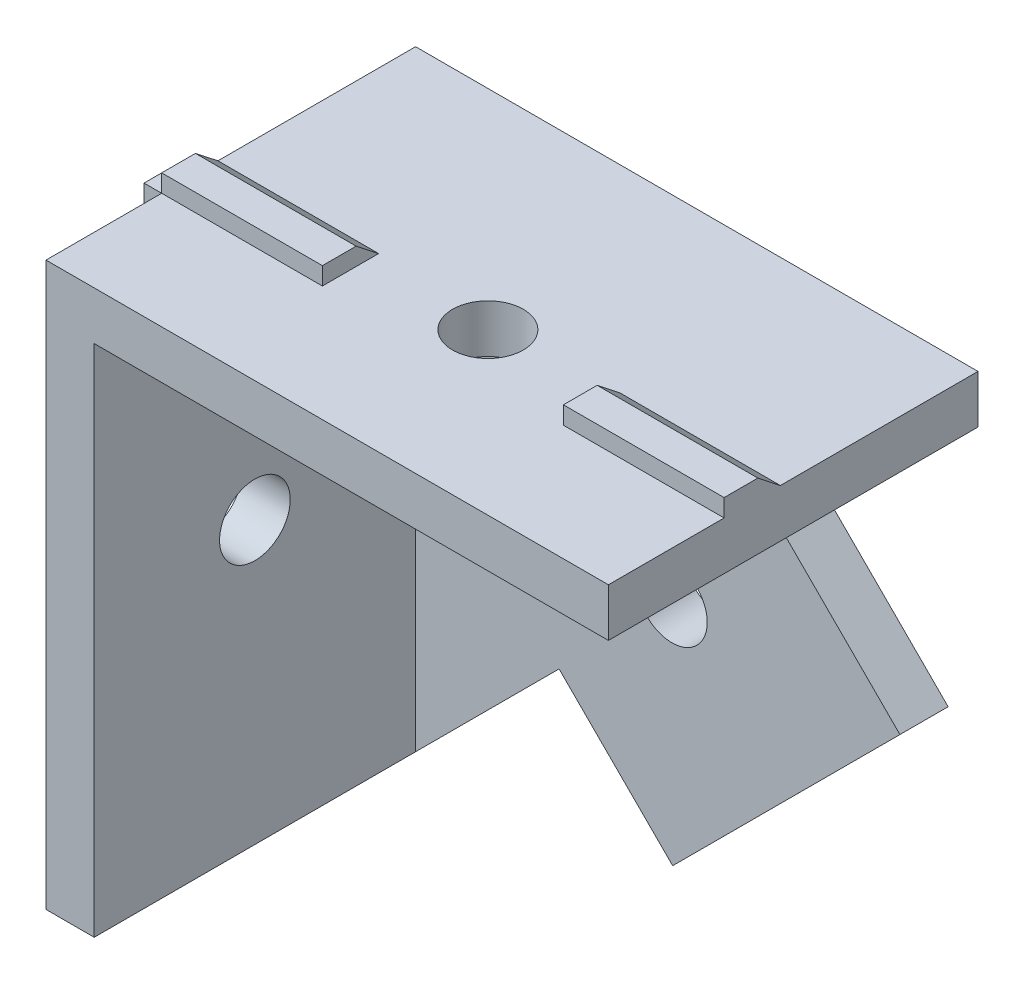
ISO-10303-21;
HEADER;
FILE_DESCRIPTION(('STEP AP214'),'2;1');
FILE_NAME('part.step','',(''),(''),'','','');
FILE_SCHEMA(('AUTOMOTIVE_DESIGN { 1 0 10303 214 1 1 1 1 }'));
ENDSEC;
DATA;
#1=APPLICATION_CONTEXT('core data for automotive mechanical design processes');
#2=APPLICATION_PROTOCOL_DEFINITION('international standard','automotive_design',2000,#1);
#3=PRODUCT_CONTEXT('',#1,'mechanical');
#4=PRODUCT('Part','Part','',(#3));
#5=PRODUCT_RELATED_PRODUCT_CATEGORY('part','',(#4));
#6=PRODUCT_DEFINITION_FORMATION('','',#4);
#7=PRODUCT_DEFINITION_CONTEXT('part definition',#1,'design');
#8=PRODUCT_DEFINITION('design','',#6,#7);
#9=PRODUCT_DEFINITION_SHAPE('','',#8);
#10=(LENGTH_UNIT() NAMED_UNIT(*) SI_UNIT(.MILLI.,.METRE.));
#11=(NAMED_UNIT(*) PLANE_ANGLE_UNIT() SI_UNIT($,.RADIAN.));
#12=(NAMED_UNIT(*) SI_UNIT($,.STERADIAN.) SOLID_ANGLE_UNIT());
#13=UNCERTAINTY_MEASURE_WITH_UNIT(LENGTH_MEASURE(1.E-05),#10,'distance_accuracy_value','');
#14=(GEOMETRIC_REPRESENTATION_CONTEXT(3) GLOBAL_UNCERTAINTY_ASSIGNED_CONTEXT((#13)) GLOBAL_UNIT_ASSIGNED_CONTEXT((#10,
#11,#12)) REPRESENTATION_CONTEXT('',''));
#15=CARTESIAN_POINT('',(0.,0.,0.));
#16=DIRECTION('',(0.,0.,1.));
#17=DIRECTION('',(1.,0.,0.));
#18=AXIS2_PLACEMENT_3D('',#15,#16,#17);
#19=CARTESIAN_POINT('',(35.,-3.,3.));
#20=DIRECTION('',(-0.707106781186547,0.707106781186547,0.));
#21=DIRECTION('',(-0.707106781186548,-0.707106781186548,0.));
#22=AXIS2_PLACEMENT_3D('',#19,#20,#21);
#23=PLANE('',#22);
#24=DIRECTION('',(0.707106781186548,0.707106781186548,0.));
#25=VECTOR('',#24,1.);
#26=CARTESIAN_POINT('',(35.,-3.,3.));
#27=LINE('',#26,#25);
#28=CARTESIAN_POINT('',(26.0705675885735,-11.9294324114265,3.));
#29=VERTEX_POINT('',#28);
#30=CARTESIAN_POINT('',(35.,-3.,3.));
#31=VERTEX_POINT('',#30);
#32=EDGE_CURVE('E50',#29,#31,#27,.T.);
#33=ORIENTED_EDGE('',*,*,#32,.F.);
#34=DIRECTION('',(0.,0.,1.));
#35=VECTOR('',#34,1.);
#36=CARTESIAN_POINT('',(26.0705675885735,-11.9294324114264,-30.0003318948885));
#37=LINE('',#36,#35);
#38=CARTESIAN_POINT('',(26.0705675885735,-11.9294324114264,0.));
#39=VERTEX_POINT('',#38);
#40=EDGE_CURVE('E219',#39,#29,#37,.T.);
#41=ORIENTED_EDGE('',*,*,#40,.F.);
#42=DIRECTION('',(0.707106781186548,0.707106781186548,0.));
#43=VECTOR('',#42,1.);
#44=CARTESIAN_POINT('',(35.,-3.,0.));
#45=LINE('',#44,#43);
#46=CARTESIAN_POINT('',(35.,-3.,0.));
#47=VERTEX_POINT('',#46);
#48=EDGE_CURVE('E217',#39,#47,#45,.T.);
#49=ORIENTED_EDGE('',*,*,#48,.T.);
#50=DIRECTION('',(0.,0.,-1.));
#51=VECTOR('',#50,1.);
#52=CARTESIAN_POINT('',(35.,-3.,3.));
#53=LINE('',#52,#51);
#54=EDGE_CURVE('E378',#31,#47,#53,.T.);
#55=ORIENTED_EDGE('',*,*,#54,.F.);
#56=EDGE_LOOP('',(#33,#41,#49,#55));
#57=FACE_BOUND('',#56,.T.);
#58=ADVANCED_FACE('F34',(#57),#23,.F.);
#59=CARTESIAN_POINT('',(-1.1,3.66878726556882,13.7));
#60=DIRECTION('',(-0.786318338822422,0.,-0.617821551931904));
#61=DIRECTION('',(-0.617821551931904,0.,0.786318338822422));
#62=AXIS2_PLACEMENT_3D('',#59,#60,#61);
#63=PLANE('',#62);
#64=DIRECTION('',(-0.617821551931904,0.,0.786318338822422));
#65=VECTOR('',#64,1.);
#66=CARTESIAN_POINT('',(-1.1,-25.,13.7));
#67=LINE('',#66,#65);
#68=CARTESIAN_POINT('',(0.,-25.,12.3));
#69=VERTEX_POINT('',#68);
#70=CARTESIAN_POINT('',(-1.1,-25.,13.7));
#71=VERTEX_POINT('',#70);
#72=EDGE_CURVE('E261',#69,#71,#67,.T.);
#73=ORIENTED_EDGE('',*,*,#72,.F.);
#74=DIRECTION('',(0.,-1.,0.));
#75=VECTOR('',#74,1.);
#76=CARTESIAN_POINT('',(0.,3.66878726556882,12.3));
#77=LINE('',#76,#75);
#78=CARTESIAN_POINT('',(0.,-35.,12.3));
#79=VERTEX_POINT('',#78);
#80=EDGE_CURVE('E11',#69,#79,#77,.T.);
#81=ORIENTED_EDGE('',*,*,#80,.T.);
#82=DIRECTION('',(0.617821551931904,0.,-0.786318338822422));
#83=VECTOR('',#82,1.);
#84=CARTESIAN_POINT('',(-1.1,-35.,13.7));
#85=LINE('',#84,#83);
#86=CARTESIAN_POINT('',(-1.1,-35.,13.7));
#87=VERTEX_POINT('',#86);
#88=EDGE_CURVE('E263',#87,#79,#85,.T.);
#89=ORIENTED_EDGE('',*,*,#88,.F.);
#90=DIRECTION('',(0.,-1.,0.));
#91=VECTOR('',#90,1.);
#92=CARTESIAN_POINT('',(-1.1,3.66878726556882,13.7));
#93=LINE('',#92,#91);
#94=EDGE_CURVE('E276',#71,#87,#93,.T.);
#95=ORIENTED_EDGE('',*,*,#94,.F.);
#96=EDGE_LOOP('',(#73,#81,#89,#95));
#97=FACE_BOUND('',#96,.T.);
#98=ADVANCED_FACE('F480',(#97),#63,.T.);
#99=CARTESIAN_POINT('',(-1.1,3.66878726556882,15.8));
#100=DIRECTION('',(-1.,0.,0.));
#101=DIRECTION('',(0.,0.,1.));
#102=AXIS2_PLACEMENT_3D('',#99,#100,#101);
#103=PLANE('',#102);
#104=DIRECTION('',(0.,0.,1.));
#105=VECTOR('',#104,1.);
#106=CARTESIAN_POINT('',(-1.1,-25.,-2.50000000007189E-05));
#107=LINE('',#106,#105);
#108=CARTESIAN_POINT('',(-1.1,-25.,15.8));
#109=VERTEX_POINT('',#108);
#110=EDGE_CURVE('E254',#71,#109,#107,.T.);
#111=ORIENTED_EDGE('',*,*,#110,.F.);
#112=ORIENTED_EDGE('',*,*,#94,.T.);
#113=DIRECTION('',(0.,0.,-1.));
#114=VECTOR('',#113,1.);
#115=CARTESIAN_POINT('',(-1.1,-35.,15.8));
#116=LINE('',#115,#114);
#117=CARTESIAN_POINT('',(-1.1,-35.,15.8));
#118=VERTEX_POINT('',#117);
#119=EDGE_CURVE('E268',#118,#87,#116,.T.);
#120=ORIENTED_EDGE('',*,*,#119,.F.);
#121=DIRECTION('',(0.,-1.,0.));
#122=VECTOR('',#121,1.);
#123=CARTESIAN_POINT('',(-1.1,3.66878726556882,15.8));
#124=LINE('',#123,#122);
#125=EDGE_CURVE('E280',#109,#118,#124,.T.);
#126=ORIENTED_EDGE('',*,*,#125,.F.);
#127=EDGE_LOOP('',(#111,#112,#120,#126));
#128=FACE_BOUND('',#127,.T.);
#129=ADVANCED_FACE('F485',(#128),#103,.T.);
#130=CARTESIAN_POINT('',(0.,3.66878726556882,15.8));
#131=DIRECTION('',(0.,0.,1.));
#132=DIRECTION('',(1.,0.,0.));
#133=AXIS2_PLACEMENT_3D('',#130,#131,#132);
#134=PLANE('',#133);
#135=DIRECTION('',(1.,0.,0.));
#136=VECTOR('',#135,1.);
#137=CARTESIAN_POINT('',(0.,-25.,15.8));
#138=LINE('',#137,#136);
#139=CARTESIAN_POINT('',(0.,-25.,15.8));
#140=VERTEX_POINT('',#139);
#141=EDGE_CURVE('E247',#109,#140,#138,.T.);
#142=ORIENTED_EDGE('',*,*,#141,.F.);
#143=ORIENTED_EDGE('',*,*,#125,.T.);
#144=DIRECTION('',(-1.,0.,0.));
#145=VECTOR('',#144,1.);
#146=CARTESIAN_POINT('',(0.,-35.,15.8));
#147=LINE('',#146,#145);
#148=CARTESIAN_POINT('',(0.,-35.,15.8));
#149=VERTEX_POINT('',#148);
#150=EDGE_CURVE('E272',#149,#118,#147,.T.);
#151=ORIENTED_EDGE('',*,*,#150,.F.);
#152=DIRECTION('',(0.,-1.,0.));
#153=VECTOR('',#152,1.);
#154=CARTESIAN_POINT('',(0.,3.66878726556882,15.8));
#155=LINE('',#154,#153);
#156=EDGE_CURVE('E291',#140,#149,#155,.T.);
#157=ORIENTED_EDGE('',*,*,#156,.F.);
#158=EDGE_LOOP('',(#142,#143,#151,#157));
#159=FACE_BOUND('',#158,.T.);
#160=ADVANCED_FACE('F588',(#159),#134,.T.);
#161=CARTESIAN_POINT('',(0.,-35.,3.));
#162=DIRECTION('',(1.,0.,0.));
#163=DIRECTION('',(0.,0.,-1.));
#164=AXIS2_PLACEMENT_3D('',#161,#162,#163);
#165=PLANE('',#164);
#166=DIRECTION('',(0.,0.,-1.));
#167=VECTOR('',#166,1.);
#168=CARTESIAN_POINT('',(0.,0.,12.3));
#169=LINE('',#168,#167);
#170=CARTESIAN_POINT('',(0.,0.,15.8));
#171=VERTEX_POINT('',#170);
#172=CARTESIAN_POINT('',(0.,0.,12.3));
#173=VERTEX_POINT('',#172);
#174=EDGE_CURVE('E312',#171,#173,#169,.T.);
#175=ORIENTED_EDGE('',*,*,#174,.F.);
#176=DIRECTION('',(0.,-1.,0.));
#177=VECTOR('',#176,1.);
#178=CARTESIAN_POINT('',(0.,0.,15.8));
#179=LINE('',#178,#177);
#180=CARTESIAN_POINT('',(0.,1.1,15.8));
#181=VERTEX_POINT('',#180);
#182=EDGE_CURVE('E336',#181,#171,#179,.T.);
#183=ORIENTED_EDGE('',*,*,#182,.F.);
#184=DIRECTION('',(0.,0.,1.));
#185=VECTOR('',#184,1.);
#186=CARTESIAN_POINT('',(0.,1.1,15.8));
#187=LINE('',#186,#185);
#188=CARTESIAN_POINT('',(0.,1.1,13.7));
#189=VERTEX_POINT('',#188);
#190=EDGE_CURVE('E333',#189,#181,#187,.T.);
#191=ORIENTED_EDGE('',*,*,#190,.F.);
#192=DIRECTION('',(0.,0.617821551931904,0.786318338822422));
#193=VECTOR('',#192,1.);
#194=CARTESIAN_POINT('',(0.,1.1,13.7));
#195=LINE('',#194,#193);
#196=EDGE_CURVE('E337',#173,#189,#195,.T.);
#197=ORIENTED_EDGE('',*,*,#196,.F.);
#198=EDGE_LOOP('',(#175,#183,#191,#197));
#199=FACE_BOUND('',#198,.T.);
#200=ADVANCED_FACE('F477',(#199),#165,.F.);
#201=CARTESIAN_POINT('',(0.,0.,15.8));
#202=DIRECTION('',(0.,0.,1.));
#203=DIRECTION('',(1.,0.,0.));
#204=AXIS2_PLACEMENT_3D('',#201,#202,#203);
#205=PLANE('',#204);
#206=DIRECTION('',(0.,1.,0.));
#207=VECTOR('',#206,1.);
#208=CARTESIAN_POINT('',(25.,1.1,15.8));
#209=LINE('',#208,#207);
#210=CARTESIAN_POINT('',(25.,0.,15.8));
#211=VERTEX_POINT('',#210);
#212=CARTESIAN_POINT('',(25.,1.1,15.8));
#213=VERTEX_POINT('',#212);
#214=EDGE_CURVE('E315',#211,#213,#209,.T.);
#215=ORIENTED_EDGE('',*,*,#214,.F.);
#216=DIRECTION('',(1.,0.,0.));
#217=VECTOR('',#216,1.);
#218=CARTESIAN_POINT('',(0.,0.,15.8));
#219=LINE('',#218,#217);
#220=CARTESIAN_POINT('',(35.,0.,15.8));
#221=VERTEX_POINT('',#220);
#222=EDGE_CURVE('E352',#211,#221,#219,.T.);
#223=ORIENTED_EDGE('',*,*,#222,.T.);
#224=DIRECTION('',(0.,-1.,0.));
#225=VECTOR('',#224,1.);
#226=CARTESIAN_POINT('',(35.,0.,15.8));
#227=LINE('',#226,#225);
#228=CARTESIAN_POINT('',(35.,1.1,15.8));
#229=VERTEX_POINT('',#228);
#230=EDGE_CURVE('E341',#229,#221,#227,.T.);
#231=ORIENTED_EDGE('',*,*,#230,.F.);
#232=DIRECTION('',(1.,0.,0.));
#233=VECTOR('',#232,1.);
#234=CARTESIAN_POINT('',(0.,1.1,15.8));
#235=LINE('',#234,#233);
#236=EDGE_CURVE('E871',#213,#229,#235,.T.);
#237=ORIENTED_EDGE('',*,*,#236,.F.);
#238=EDGE_LOOP('',(#215,#223,#231,#237));
#239=FACE_BOUND('',#238,.T.);
#240=ADVANCED_FACE('F595',(#239),#205,.T.);
#241=CARTESIAN_POINT('',(0.,1.1,15.8));
#242=DIRECTION('',(0.,1.,0.));
#243=DIRECTION('',(0.,0.,1.));
#244=AXIS2_PLACEMENT_3D('',#241,#242,#243);
#245=PLANE('',#244);
#246=DIRECTION('',(0.,0.,1.));
#247=VECTOR('',#246,1.);
#248=CARTESIAN_POINT('',(25.,1.1,-2.50000000007189E-05));
#249=LINE('',#248,#247);
#250=CARTESIAN_POINT('',(25.,1.1,13.7));
#251=VERTEX_POINT('',#250);
#252=EDGE_CURVE('E323',#251,#213,#249,.T.);
#253=ORIENTED_EDGE('',*,*,#252,.T.);
#254=ORIENTED_EDGE('',*,*,#236,.T.);
#255=DIRECTION('',(0.,0.,1.));
#256=VECTOR('',#255,1.);
#257=CARTESIAN_POINT('',(35.,1.1,15.8));
#258=LINE('',#257,#256);
#259=CARTESIAN_POINT('',(35.,1.1,13.7));
#260=VERTEX_POINT('',#259);
#261=EDGE_CURVE('E338',#260,#229,#258,.T.);
#262=ORIENTED_EDGE('',*,*,#261,.F.);
#263=DIRECTION('',(1.,0.,0.));
#264=VECTOR('',#263,1.);
#265=CARTESIAN_POINT('',(0.,1.1,13.7));
#266=LINE('',#265,#264);
#267=EDGE_CURVE('E398',#251,#260,#266,.T.);
#268=ORIENTED_EDGE('',*,*,#267,.F.);
#269=EDGE_LOOP('',(#253,#254,#262,#268));
#270=FACE_BOUND('',#269,.T.);
#271=ADVANCED_FACE('F734',(#270),#245,.T.);
#272=CARTESIAN_POINT('',(0.,1.1,13.7));
#273=DIRECTION('',(0.,0.786318338822422,-0.617821551931904));
#274=DIRECTION('',(0.,0.617821551931904,0.786318338822422));
#275=AXIS2_PLACEMENT_3D('',#272,#273,#274);
#276=PLANE('',#275);
#277=DIRECTION('',(0.,-0.617821551931904,-0.786318338822422));
#278=VECTOR('',#277,1.);
#279=CARTESIAN_POINT('',(25.,1.1,13.7));
#280=LINE('',#279,#278);
#281=CARTESIAN_POINT('',(25.,0.,12.3));
#282=VERTEX_POINT('',#281);
#283=EDGE_CURVE('E43',#251,#282,#280,.T.);
#284=ORIENTED_EDGE('',*,*,#283,.F.);
#285=ORIENTED_EDGE('',*,*,#267,.T.);
#286=DIRECTION('',(0.,0.617821551931904,0.786318338822422));
#287=VECTOR('',#286,1.);
#288=CARTESIAN_POINT('',(35.,1.1,13.7));
#289=LINE('',#288,#287);
#290=CARTESIAN_POINT('',(35.,0.,12.3));
#291=VERTEX_POINT('',#290);
#292=EDGE_CURVE('E326',#291,#260,#289,.T.);
#293=ORIENTED_EDGE('',*,*,#292,.F.);
#294=DIRECTION('',(1.,0.,0.));
#295=VECTOR('',#294,1.);
#296=CARTESIAN_POINT('',(0.,0.,12.3));
#297=LINE('',#296,#295);
#298=EDGE_CURVE('E377',#282,#291,#297,.T.);
#299=ORIENTED_EDGE('',*,*,#298,.F.);
#300=EDGE_LOOP('',(#284,#285,#293,#299));
#301=FACE_BOUND('',#300,.T.);
#302=ADVANCED_FACE('F424',(#301),#276,.T.);
#303=CARTESIAN_POINT('',(0.,0.,3.));
#304=DIRECTION('',(0.,0.,-1.));
#305=DIRECTION('',(-1.,0.,0.));
#306=AXIS2_PLACEMENT_3D('',#303,#304,#305);
#307=PLANE('',#306);
#308=CARTESIAN_POINT('',(18.9509983514393,-18.9519969636923,3.));
#309=DIRECTION('',(0.,0.,1.));
#310=DIRECTION('',(1.,0.,0.));
#311=AXIS2_PLACEMENT_3D('',#308,#309,#310);
#312=CIRCLE('',#311,2.19999652649059);
#313=CARTESIAN_POINT('',(21.1509948779299,-18.9519969636923,3.));
#314=VERTEX_POINT('',#313);
#315=EDGE_CURVE('E456',#314,#314,#312,.T.);
#316=ORIENTED_EDGE('',*,*,#315,.F.);
#317=EDGE_LOOP('',(#316));
#318=FACE_BOUND('',#317,.T.);
#319=DIRECTION('',(1.,0.,0.));
#320=VECTOR('',#319,1.);
#321=CARTESIAN_POINT('',(35.,-3.,3.));
#322=LINE('',#321,#320);
#323=CARTESIAN_POINT('',(3.,-3.,3.));
#324=VERTEX_POINT('',#323);
#325=EDGE_CURVE('E562',#324,#31,#322,.T.);
#326=ORIENTED_EDGE('',*,*,#325,.F.);
#327=DIRECTION('',(0.,1.,0.));
#328=VECTOR('',#327,1.);
#329=CARTESIAN_POINT('',(3.,-3.,3.));
#330=LINE('',#329,#328);
#331=CARTESIAN_POINT('',(3.,-35.,3.));
#332=VERTEX_POINT('',#331);
#333=EDGE_CURVE('E555',#332,#324,#330,.T.);
#334=ORIENTED_EDGE('',*,*,#333,.F.);
#335=CARTESIAN_POINT('',(11.928562350299,-26.071437649701,3.));
#336=VERTEX_POINT('',#335);
#337=EDGE_CURVE('E441',#332,#336,#27,.T.);
#338=ORIENTED_EDGE('',*,*,#337,.T.);
#339=DIRECTION('',(0.70705052147541,-0.707163036421836,0.));
#340=VECTOR('',#339,1.);
#341=CARTESIAN_POINT('',(18.9988701489373,-33.1428705663881,3.));
#342=LINE('',#341,#340);
#343=CARTESIAN_POINT('',(18.9988701489373,-33.1428705663881,3.));
#344=VERTEX_POINT('',#343);
#345=EDGE_CURVE('E238',#336,#344,#342,.T.);
#346=ORIENTED_EDGE('',*,*,#345,.T.);
#347=DIRECTION('',(0.707163036421835,0.70705052147541,0.));
#348=VECTOR('',#347,1.);
#349=CARTESIAN_POINT('',(33.1420004367828,-19.0019905567169,3.));
#350=LINE('',#349,#348);
#351=CARTESIAN_POINT('',(33.1420004367828,-19.0019905567169,3.));
#352=VERTEX_POINT('',#351);
#353=EDGE_CURVE('E234',#344,#352,#350,.T.);
#354=ORIENTED_EDGE('',*,*,#353,.T.);
#355=DIRECTION('',(-0.70705052147541,0.707163036421835,0.));
#356=VECTOR('',#355,1.);
#357=CARTESIAN_POINT('',(26.0705675885735,-11.9294324114264,3.));
#358=LINE('',#357,#356);
#359=EDGE_CURVE('E225',#352,#29,#358,.T.);
#360=ORIENTED_EDGE('',*,*,#359,.T.);
#361=ORIENTED_EDGE('',*,*,#32,.T.);
#362=EDGE_LOOP('',(#326,#334,#338,#346,#354,#360,#361));
#363=FACE_BOUND('',#362,.T.);
#364=ADVANCED_FACE('F452',(#318,#363),#307,.F.);
#365=CARTESIAN_POINT('',(3.,-35.,3.));
#366=DIRECTION('',(0.,1.,0.));
#367=DIRECTION('',(0.,0.,1.));
#368=AXIS2_PLACEMENT_3D('',#365,#366,#367);
#369=PLANE('',#368);
#370=DIRECTION('',(1.,0.,0.));
#371=VECTOR('',#370,1.);
#372=CARTESIAN_POINT('',(3.,-35.,0.));
#373=LINE('',#372,#371);
#374=CARTESIAN_POINT('',(0.,-35.,0.));
#375=VERTEX_POINT('',#374);
#376=CARTESIAN_POINT('',(3.,-35.,0.));
#377=VERTEX_POINT('',#376);
#378=EDGE_CURVE('E440',#375,#377,#373,.T.);
#379=ORIENTED_EDGE('',*,*,#378,.T.);
#380=DIRECTION('',(0.,0.,-1.));
#381=VECTOR('',#380,1.);
#382=CARTESIAN_POINT('',(3.,-35.,3.));
#383=LINE('',#382,#381);
#384=EDGE_CURVE('E375',#332,#377,#383,.T.);
#385=ORIENTED_EDGE('',*,*,#384,.F.);
#386=DIRECTION('',(0.,0.,-1.));
#387=VECTOR('',#386,1.);
#388=CARTESIAN_POINT('',(3.,-35.,23.));
#389=LINE('',#388,#387);
#390=CARTESIAN_POINT('',(3.,-35.,23.));
#391=VERTEX_POINT('',#390);
#392=EDGE_CURVE('E446',#391,#332,#389,.T.);
#393=ORIENTED_EDGE('',*,*,#392,.F.);
#394=DIRECTION('',(1.,0.,0.));
#395=VECTOR('',#394,1.);
#396=CARTESIAN_POINT('',(3.,-35.,23.));
#397=LINE('',#396,#395);
#398=CARTESIAN_POINT('',(0.,-35.,23.));
#399=VERTEX_POINT('',#398);
#400=EDGE_CURVE('E558',#399,#391,#397,.T.);
#401=ORIENTED_EDGE('',*,*,#400,.F.);
#402=DIRECTION('',(0.,0.,-1.));
#403=VECTOR('',#402,1.);
#404=CARTESIAN_POINT('',(0.,-35.,3.));
#405=LINE('',#404,#403);
#406=EDGE_CURVE('E355',#399,#149,#405,.T.);
#407=ORIENTED_EDGE('',*,*,#406,.T.);
#408=ORIENTED_EDGE('',*,*,#150,.T.);
#409=ORIENTED_EDGE('',*,*,#119,.T.);
#410=ORIENTED_EDGE('',*,*,#88,.T.);
#411=EDGE_CURVE('E305',#79,#375,#405,.T.);
#412=ORIENTED_EDGE('',*,*,#411,.T.);
#413=EDGE_LOOP('',(#379,#385,#393,#401,#407,#408,#409,#410,#412));
#414=FACE_BOUND('',#413,.T.);
#415=ADVANCED_FACE('F36',(#414),#369,.F.);
#416=CARTESIAN_POINT('',(11.928562350299,-26.071437649701,0.));
#417=VERTEX_POINT('',#416);
#418=EDGE_CURVE('E449',#377,#417,#45,.T.);
#419=ORIENTED_EDGE('',*,*,#418,.T.);
#420=DIRECTION('',(0.,0.,1.));
#421=VECTOR('',#420,1.);
#422=CARTESIAN_POINT('',(11.928562350299,-26.071437649701,-30.0003318948885));
#423=LINE('',#422,#421);
#424=EDGE_CURVE('E58',#417,#336,#423,.T.);
#425=ORIENTED_EDGE('',*,*,#424,.T.);
#426=ORIENTED_EDGE('',*,*,#337,.F.);
#427=ORIENTED_EDGE('',*,*,#384,.T.);
#428=EDGE_LOOP('',(#419,#425,#426,#427));
#429=FACE_BOUND('',#428,.T.);
#430=ADVANCED_FACE('F481',(#429),#23,.F.);
#431=CARTESIAN_POINT('',(35.,0.,3.));
#432=DIRECTION('',(-1.,0.,0.));
#433=DIRECTION('',(0.,0.,1.));
#434=AXIS2_PLACEMENT_3D('',#431,#432,#433);
#435=PLANE('',#434);
#436=DIRECTION('',(0.,1.,0.));
#437=VECTOR('',#436,1.);
#438=CARTESIAN_POINT('',(35.,0.,0.));
#439=LINE('',#438,#437);
#440=CARTESIAN_POINT('',(35.,0.,0.));
#441=VERTEX_POINT('',#440);
#442=EDGE_CURVE('E428',#47,#441,#439,.T.);
#443=ORIENTED_EDGE('',*,*,#442,.T.);
#444=DIRECTION('',(0.,0.,-1.));
#445=VECTOR('',#444,1.);
#446=CARTESIAN_POINT('',(35.,0.,3.));
#447=LINE('',#446,#445);
#448=EDGE_CURVE('E374',#291,#441,#447,.T.);
#449=ORIENTED_EDGE('',*,*,#448,.F.);
#450=ORIENTED_EDGE('',*,*,#292,.T.);
#451=ORIENTED_EDGE('',*,*,#261,.T.);
#452=ORIENTED_EDGE('',*,*,#230,.T.);
#453=CARTESIAN_POINT('',(35.,0.,23.));
#454=VERTEX_POINT('',#453);
#455=EDGE_CURVE('E380',#454,#221,#447,.T.);
#456=ORIENTED_EDGE('',*,*,#455,.F.);
#457=DIRECTION('',(0.,1.,0.));
#458=VECTOR('',#457,1.);
#459=CARTESIAN_POINT('',(35.,0.,23.));
#460=LINE('',#459,#458);
#461=CARTESIAN_POINT('',(35.,-3.,23.));
#462=VERTEX_POINT('',#461);
#463=EDGE_CURVE('E566',#462,#454,#460,.T.);
#464=ORIENTED_EDGE('',*,*,#463,.F.);
#465=DIRECTION('',(0.,0.,-1.));
#466=VECTOR('',#465,1.);
#467=CARTESIAN_POINT('',(35.,-3.,23.));
#468=LINE('',#467,#466);
#469=EDGE_CURVE('E574',#462,#31,#468,.T.);
#470=ORIENTED_EDGE('',*,*,#469,.T.);
#471=ORIENTED_EDGE('',*,*,#54,.T.);
#472=EDGE_LOOP('',(#443,#449,#450,#451,#452,#456,#464,#470,#471));
#473=FACE_BOUND('',#472,.T.);
#474=ADVANCED_FACE('F427',(#473),#435,.F.);
#475=CARTESIAN_POINT('',(0.,0.,3.));
#476=DIRECTION('',(0.,-1.,0.));
#477=DIRECTION('',(0.,0.,-1.));
#478=AXIS2_PLACEMENT_3D('',#475,#476,#477);
#479=PLANE('',#478);
#480=CARTESIAN_POINT('',(10.,0.,12.3));
#481=VERTEX_POINT('',#480);
#482=EDGE_CURVE('E394',#173,#481,#297,.T.);
#483=ORIENTED_EDGE('',*,*,#482,.T.);
#484=DIRECTION('',(0.,0.,1.));
#485=VECTOR('',#484,1.);
#486=CARTESIAN_POINT('',(10.,0.,-2.50000000007189E-05));
#487=LINE('',#486,#485);
#488=CARTESIAN_POINT('',(10.,0.,15.8));
#489=VERTEX_POINT('',#488);
#490=EDGE_CURVE('E327',#481,#489,#487,.T.);
#491=ORIENTED_EDGE('',*,*,#490,.T.);
#492=EDGE_CURVE('E348',#171,#489,#219,.T.);
#493=ORIENTED_EDGE('',*,*,#492,.F.);
#494=DIRECTION('',(0.,0.,-1.));
#495=VECTOR('',#494,1.);
#496=CARTESIAN_POINT('',(0.,0.,3.));
#497=LINE('',#496,#495);
#498=CARTESIAN_POINT('',(0.,0.,23.));
#499=VERTEX_POINT('',#498);
#500=EDGE_CURVE('E371',#499,#171,#497,.T.);
#501=ORIENTED_EDGE('',*,*,#500,.F.);
#502=DIRECTION('',(-1.,0.,0.));
#503=VECTOR('',#502,1.);
#504=CARTESIAN_POINT('',(0.,0.,23.));
#505=LINE('',#504,#503);
#506=EDGE_CURVE('E569',#454,#499,#505,.T.);
#507=ORIENTED_EDGE('',*,*,#506,.F.);
#508=ORIENTED_EDGE('',*,*,#455,.T.);
#509=ORIENTED_EDGE('',*,*,#222,.F.);
#510=DIRECTION('',(0.,0.,1.));
#511=VECTOR('',#510,1.);
#512=CARTESIAN_POINT('',(25.,0.,-2.50000000007189E-05));
#513=LINE('',#512,#511);
#514=EDGE_CURVE('E324',#282,#211,#513,.T.);
#515=ORIENTED_EDGE('',*,*,#514,.F.);
#516=ORIENTED_EDGE('',*,*,#298,.T.);
#517=ORIENTED_EDGE('',*,*,#448,.T.);
#518=DIRECTION('',(-1.,0.,0.));
#519=VECTOR('',#518,1.);
#520=CARTESIAN_POINT('',(0.,0.,0.));
#521=LINE('',#520,#519);
#522=CARTESIAN_POINT('',(0.,0.,0.));
#523=VERTEX_POINT('',#522);
#524=EDGE_CURVE('E431',#441,#523,#521,.T.);
#525=ORIENTED_EDGE('',*,*,#524,.T.);
#526=EDGE_CURVE('E356',#173,#523,#497,.T.);
#527=ORIENTED_EDGE('',*,*,#526,.F.);
#528=EDGE_LOOP('',(#483,#491,#493,#501,#507,#508,#509,#515,#516,#517,#525,#527));
#529=FACE_BOUND('',#528,.T.);
#530=CARTESIAN_POINT('',(17.5,0.,13.));
#531=DIRECTION('',(0.,-1.,0.));
#532=DIRECTION('',(0.,0.,-1.));
#533=AXIS2_PLACEMENT_3D('',#530,#531,#532);
#534=CIRCLE('',#533,2.2);
#535=CARTESIAN_POINT('',(17.5,0.,10.8));
#536=VERTEX_POINT('',#535);
#537=EDGE_CURVE('E552',#536,#536,#534,.T.);
#538=ORIENTED_EDGE('',*,*,#537,.T.);
#539=EDGE_LOOP('',(#538));
#540=FACE_BOUND('',#539,.T.);
#541=ADVANCED_FACE('F421',(#529,#540),#479,.F.);
#542=CARTESIAN_POINT('',(0.,-17.5,13.));
#543=DIRECTION('',(1.,0.,0.));
#544=DIRECTION('',(0.,0.,-1.));
#545=AXIS2_PLACEMENT_3D('',#542,#543,#544);
#546=CIRCLE('',#545,2.2);
#547=CARTESIAN_POINT('',(0.,-17.5,10.8));
#548=VERTEX_POINT('',#547);
#549=EDGE_CURVE('E402',#548,#548,#546,.T.);
#550=ORIENTED_EDGE('',*,*,#549,.T.);
#551=EDGE_LOOP('',(#550));
#552=FACE_BOUND('',#551,.T.);
#553=ORIENTED_EDGE('',*,*,#500,.T.);
#554=CARTESIAN_POINT('',(0.,-10.,15.8));
#555=VERTEX_POINT('',#554);
#556=EDGE_CURVE('E287',#171,#555,#155,.T.);
#557=ORIENTED_EDGE('',*,*,#556,.T.);
#558=DIRECTION('',(0.,0.,1.));
#559=VECTOR('',#558,1.);
#560=CARTESIAN_POINT('',(0.,-10.,-2.50000000007189E-05));
#561=LINE('',#560,#559);
#562=CARTESIAN_POINT('',(0.,-10.,12.3));
#563=VERTEX_POINT('',#562);
#564=EDGE_CURVE('E250',#563,#555,#561,.T.);
#565=ORIENTED_EDGE('',*,*,#564,.F.);
#566=EDGE_CURVE('E271',#173,#563,#77,.T.);
#567=ORIENTED_EDGE('',*,*,#566,.F.);
#568=ORIENTED_EDGE('',*,*,#526,.T.);
#569=DIRECTION('',(0.,-1.,0.));
#570=VECTOR('',#569,1.);
#571=CARTESIAN_POINT('',(0.,-35.,0.));
#572=LINE('',#571,#570);
#573=EDGE_CURVE('E360',#523,#375,#572,.T.);
#574=ORIENTED_EDGE('',*,*,#573,.T.);
#575=ORIENTED_EDGE('',*,*,#411,.F.);
#576=ORIENTED_EDGE('',*,*,#80,.F.);
#577=DIRECTION('',(0.,0.,1.));
#578=VECTOR('',#577,1.);
#579=CARTESIAN_POINT('',(0.,-25.,-2.50000000007189E-05));
#580=LINE('',#579,#578);
#581=EDGE_CURVE('E251',#69,#140,#580,.T.);
#582=ORIENTED_EDGE('',*,*,#581,.T.);
#583=ORIENTED_EDGE('',*,*,#156,.T.);
#584=ORIENTED_EDGE('',*,*,#406,.F.);
#585=DIRECTION('',(0.,-1.,0.));
#586=VECTOR('',#585,1.);
#587=CARTESIAN_POINT('',(0.,-35.,23.));
#588=LINE('',#587,#586);
#589=EDGE_CURVE('E571',#499,#399,#588,.T.);
#590=ORIENTED_EDGE('',*,*,#589,.F.);
#591=EDGE_LOOP('',(#553,#557,#565,#567,#568,#574,#575,#576,#582,#583,#584,#590));
#592=FACE_BOUND('',#591,.T.);
#593=ADVANCED_FACE('F435',(#552,#592),#165,.F.);
#594=CARTESIAN_POINT('',(0.,0.,0.));
#595=DIRECTION('',(0.,0.,-1.));
#596=DIRECTION('',(-1.,0.,0.));
#597=AXIS2_PLACEMENT_3D('',#594,#595,#596);
#598=PLANE('',#597);
#599=CARTESIAN_POINT('',(18.9509983514393,-18.9519969636923,0.));
#600=DIRECTION('',(0.,0.,-1.));
#601=DIRECTION('',(-1.,0.,0.));
#602=AXIS2_PLACEMENT_3D('',#599,#600,#601);
#603=CIRCLE('',#602,2.19999652649059);
#604=CARTESIAN_POINT('',(16.7510018249487,-18.9519969636923,0.));
#605=VERTEX_POINT('',#604);
#606=EDGE_CURVE('E38',#605,#605,#603,.T.);
#607=ORIENTED_EDGE('',*,*,#606,.F.);
#608=EDGE_LOOP('',(#607));
#609=FACE_BOUND('',#608,.T.);
#610=ORIENTED_EDGE('',*,*,#378,.F.);
#611=ORIENTED_EDGE('',*,*,#573,.F.);
#612=ORIENTED_EDGE('',*,*,#524,.F.);
#613=ORIENTED_EDGE('',*,*,#442,.F.);
#614=ORIENTED_EDGE('',*,*,#48,.F.);
#615=DIRECTION('',(-0.70705052147541,0.707163036421836,0.));
#616=VECTOR('',#615,1.);
#617=CARTESIAN_POINT('',(26.0705675885735,-11.9294324114264,0.));
#618=LINE('',#617,#616);
#619=CARTESIAN_POINT('',(33.1420004367828,-19.0019905567169,0.));
#620=VERTEX_POINT('',#619);
#621=EDGE_CURVE('E208',#620,#39,#618,.T.);
#622=ORIENTED_EDGE('',*,*,#621,.F.);
#623=DIRECTION('',(0.707163036421835,0.70705052147541,0.));
#624=VECTOR('',#623,1.);
#625=CARTESIAN_POINT('',(33.1420004367828,-19.0019905567169,0.));
#626=LINE('',#625,#624);
#627=CARTESIAN_POINT('',(18.9988701489373,-33.1428705663881,0.));
#628=VERTEX_POINT('',#627);
#629=EDGE_CURVE('E214',#628,#620,#626,.T.);
#630=ORIENTED_EDGE('',*,*,#629,.F.);
#631=DIRECTION('',(0.70705052147541,-0.707163036421836,0.));
#632=VECTOR('',#631,1.);
#633=CARTESIAN_POINT('',(18.9988701489373,-33.1428705663881,0.));
#634=LINE('',#633,#632);
#635=EDGE_CURVE('E240',#417,#628,#634,.T.);
#636=ORIENTED_EDGE('',*,*,#635,.F.);
#637=ORIENTED_EDGE('',*,*,#418,.F.);
#638=EDGE_LOOP('',(#610,#611,#612,#613,#614,#622,#630,#636,#637));
#639=FACE_BOUND('',#638,.T.);
#640=ADVANCED_FACE('F211',(#609,#639),#598,.T.);
#641=CARTESIAN_POINT('',(3.,-3.,23.));
#642=DIRECTION('',(-1.,0.,0.));
#643=DIRECTION('',(0.,0.,1.));
#644=AXIS2_PLACEMENT_3D('',#641,#642,#643);
#645=PLANE('',#644);
#646=CARTESIAN_POINT('',(3.,-17.5,13.));
#647=DIRECTION('',(1.,0.,0.));
#648=DIRECTION('',(0.,0.,-1.));
#649=AXIS2_PLACEMENT_3D('',#646,#647,#648);
#650=CIRCLE('',#649,2.2);
#651=CARTESIAN_POINT('',(3.,-17.5,10.8));
#652=VERTEX_POINT('',#651);
#653=EDGE_CURVE('E545',#652,#652,#650,.T.);
#654=ORIENTED_EDGE('',*,*,#653,.F.);
#655=EDGE_LOOP('',(#654));
#656=FACE_BOUND('',#655,.T.);
#657=ORIENTED_EDGE('',*,*,#333,.T.);
#658=DIRECTION('',(0.,0.,-1.));
#659=VECTOR('',#658,1.);
#660=CARTESIAN_POINT('',(3.,-3.,23.));
#661=LINE('',#660,#659);
#662=CARTESIAN_POINT('',(3.,-3.,23.));
#663=VERTEX_POINT('',#662);
#664=EDGE_CURVE('E578',#663,#324,#661,.T.);
#665=ORIENTED_EDGE('',*,*,#664,.F.);
#666=DIRECTION('',(0.,1.,0.));
#667=VECTOR('',#666,1.);
#668=CARTESIAN_POINT('',(3.,-3.,23.));
#669=LINE('',#668,#667);
#670=EDGE_CURVE('E561',#391,#663,#669,.T.);
#671=ORIENTED_EDGE('',*,*,#670,.F.);
#672=ORIENTED_EDGE('',*,*,#392,.T.);
#673=EDGE_LOOP('',(#657,#665,#671,#672));
#674=FACE_BOUND('',#673,.T.);
#675=ADVANCED_FACE('F466',(#656,#674),#645,.F.);
#676=CARTESIAN_POINT('',(35.,-3.,23.));
#677=DIRECTION('',(0.,1.,0.));
#678=DIRECTION('',(0.,0.,1.));
#679=AXIS2_PLACEMENT_3D('',#676,#677,#678);
#680=PLANE('',#679);
#681=CARTESIAN_POINT('',(17.5,-3.,13.));
#682=DIRECTION('',(0.,-1.,0.));
#683=DIRECTION('',(0.,0.,-1.));
#684=AXIS2_PLACEMENT_3D('',#681,#682,#683);
#685=CIRCLE('',#684,2.2);
#686=CARTESIAN_POINT('',(17.5,-3.,10.8));
#687=VERTEX_POINT('',#686);
#688=EDGE_CURVE('E550',#687,#687,#685,.T.);
#689=ORIENTED_EDGE('',*,*,#688,.F.);
#690=EDGE_LOOP('',(#689));
#691=FACE_BOUND('',#690,.T.);
#692=ORIENTED_EDGE('',*,*,#325,.T.);
#693=ORIENTED_EDGE('',*,*,#469,.F.);
#694=DIRECTION('',(1.,0.,0.));
#695=VECTOR('',#694,1.);
#696=CARTESIAN_POINT('',(35.,-3.,23.));
#697=LINE('',#696,#695);
#698=EDGE_CURVE('E564',#663,#462,#697,.T.);
#699=ORIENTED_EDGE('',*,*,#698,.F.);
#700=ORIENTED_EDGE('',*,*,#664,.T.);
#701=EDGE_LOOP('',(#692,#693,#699,#700));
#702=FACE_BOUND('',#701,.T.);
#703=ADVANCED_FACE('F472',(#691,#702),#680,.F.);
#704=CARTESIAN_POINT('',(0.,0.,23.));
#705=DIRECTION('',(0.,0.,-1.));
#706=DIRECTION('',(-1.,0.,0.));
#707=AXIS2_PLACEMENT_3D('',#704,#705,#706);
#708=PLANE('',#707);
#709=ORIENTED_EDGE('',*,*,#400,.T.);
#710=ORIENTED_EDGE('',*,*,#670,.T.);
#711=ORIENTED_EDGE('',*,*,#698,.T.);
#712=ORIENTED_EDGE('',*,*,#463,.T.);
#713=ORIENTED_EDGE('',*,*,#506,.T.);
#714=ORIENTED_EDGE('',*,*,#589,.T.);
#715=EDGE_LOOP('',(#709,#710,#711,#712,#713,#714));
#716=FACE_BOUND('',#715,.T.);
#717=ADVANCED_FACE('F586',(#716),#708,.F.);
#718=CARTESIAN_POINT('',(17.5,0.,13.));
#719=DIRECTION('',(0.,-1.,0.));
#720=DIRECTION('',(0.,0.,-1.));
#721=AXIS2_PLACEMENT_3D('',#718,#719,#720);
#722=CYLINDRICAL_SURFACE('',#721,2.2);
#723=ORIENTED_EDGE('',*,*,#537,.F.);
#724=EDGE_LOOP('',(#723));
#725=FACE_BOUND('',#724,.T.);
#726=ORIENTED_EDGE('',*,*,#688,.T.);
#727=EDGE_LOOP('',(#726));
#728=FACE_BOUND('',#727,.T.);
#729=ADVANCED_FACE('F689',(#725,#728),#722,.F.);
#730=CARTESIAN_POINT('',(0.,-17.5,13.));
#731=DIRECTION('',(1.,0.,0.));
#732=DIRECTION('',(0.,0.,-1.));
#733=AXIS2_PLACEMENT_3D('',#730,#731,#732);
#734=CYLINDRICAL_SURFACE('',#733,2.2);
#735=ORIENTED_EDGE('',*,*,#549,.F.);
#736=EDGE_LOOP('',(#735));
#737=FACE_BOUND('',#736,.T.);
#738=ORIENTED_EDGE('',*,*,#653,.T.);
#739=EDGE_LOOP('',(#738));
#740=FACE_BOUND('',#739,.T.);
#741=ADVANCED_FACE('F684',(#737,#740),#734,.F.);
#742=DIRECTION('',(0.,-1.,0.));
#743=VECTOR('',#742,1.);
#744=CARTESIAN_POINT('',(10.,1.1,15.8));
#745=LINE('',#744,#743);
#746=CARTESIAN_POINT('',(10.,1.1,15.8));
#747=VERTEX_POINT('',#746);
#748=EDGE_CURVE('E320',#747,#489,#745,.T.);
#749=ORIENTED_EDGE('',*,*,#748,.F.);
#750=EDGE_CURVE('E344',#181,#747,#235,.T.);
#751=ORIENTED_EDGE('',*,*,#750,.F.);
#752=ORIENTED_EDGE('',*,*,#182,.T.);
#753=ORIENTED_EDGE('',*,*,#492,.T.);
#754=EDGE_LOOP('',(#749,#751,#752,#753));
#755=FACE_BOUND('',#754,.T.);
#756=ADVANCED_FACE('F542',(#755),#205,.T.);
#757=DIRECTION('',(0.,0.,1.));
#758=VECTOR('',#757,1.);
#759=CARTESIAN_POINT('',(10.,1.1,-2.50000000007189E-05));
#760=LINE('',#759,#758);
#761=CARTESIAN_POINT('',(10.,1.1,13.7));
#762=VERTEX_POINT('',#761);
#763=EDGE_CURVE('E329',#762,#747,#760,.T.);
#764=ORIENTED_EDGE('',*,*,#763,.F.);
#765=EDGE_CURVE('E401',#189,#762,#266,.T.);
#766=ORIENTED_EDGE('',*,*,#765,.F.);
#767=ORIENTED_EDGE('',*,*,#190,.T.);
#768=ORIENTED_EDGE('',*,*,#750,.T.);
#769=EDGE_LOOP('',(#764,#766,#767,#768));
#770=FACE_BOUND('',#769,.T.);
#771=ADVANCED_FACE('F728',(#770),#245,.T.);
#772=DIRECTION('',(0.,0.617821551931904,0.786318338822422));
#773=VECTOR('',#772,1.);
#774=CARTESIAN_POINT('',(10.,1.1,13.7));
#775=LINE('',#774,#773);
#776=EDGE_CURVE('E407',#481,#762,#775,.T.);
#777=ORIENTED_EDGE('',*,*,#776,.F.);
#778=ORIENTED_EDGE('',*,*,#482,.F.);
#779=ORIENTED_EDGE('',*,*,#196,.T.);
#780=ORIENTED_EDGE('',*,*,#765,.T.);
#781=EDGE_LOOP('',(#777,#778,#779,#780));
#782=FACE_BOUND('',#781,.T.);
#783=ADVANCED_FACE('F656',(#782),#276,.T.);
#784=CARTESIAN_POINT('',(25.,1.1,-2.50000000007189E-05));
#785=DIRECTION('',(1.,0.,0.));
#786=DIRECTION('',(0.,0.,-1.));
#787=AXIS2_PLACEMENT_3D('',#784,#785,#786);
#788=PLANE('',#787);
#789=ORIENTED_EDGE('',*,*,#283,.T.);
#790=ORIENTED_EDGE('',*,*,#514,.T.);
#791=ORIENTED_EDGE('',*,*,#214,.T.);
#792=ORIENTED_EDGE('',*,*,#252,.F.);
#793=EDGE_LOOP('',(#789,#790,#791,#792));
#794=FACE_BOUND('',#793,.T.);
#795=ADVANCED_FACE('F416',(#794),#788,.F.);
#796=CARTESIAN_POINT('',(10.,1.1,-2.50000000007189E-05));
#797=DIRECTION('',(-1.,0.,0.));
#798=DIRECTION('',(0.,0.,1.));
#799=AXIS2_PLACEMENT_3D('',#796,#797,#798);
#800=PLANE('',#799);
#801=ORIENTED_EDGE('',*,*,#776,.T.);
#802=ORIENTED_EDGE('',*,*,#763,.T.);
#803=ORIENTED_EDGE('',*,*,#748,.T.);
#804=ORIENTED_EDGE('',*,*,#490,.F.);
#805=EDGE_LOOP('',(#801,#802,#803,#804));
#806=FACE_BOUND('',#805,.T.);
#807=ADVANCED_FACE('F606',(#806),#800,.F.);
#808=DIRECTION('',(0.617821551931904,0.,-0.786318338822422));
#809=VECTOR('',#808,1.);
#810=CARTESIAN_POINT('',(-1.1,-10.,13.7));
#811=LINE('',#810,#809);
#812=CARTESIAN_POINT('',(-1.1,-10.,13.7));
#813=VERTEX_POINT('',#812);
#814=EDGE_CURVE('E253',#813,#563,#811,.T.);
#815=ORIENTED_EDGE('',*,*,#814,.F.);
#816=CARTESIAN_POINT('',(-1.1,0.,13.7));
#817=VERTEX_POINT('',#816);
#818=EDGE_CURVE('E273',#817,#813,#93,.T.);
#819=ORIENTED_EDGE('',*,*,#818,.F.);
#820=DIRECTION('',(-0.617821551931904,0.,0.786318338822422));
#821=VECTOR('',#820,1.);
#822=CARTESIAN_POINT('',(-1.1,0.,13.7));
#823=LINE('',#822,#821);
#824=EDGE_CURVE('E266',#173,#817,#823,.T.);
#825=ORIENTED_EDGE('',*,*,#824,.F.);
#826=ORIENTED_EDGE('',*,*,#566,.T.);
#827=EDGE_LOOP('',(#815,#819,#825,#826));
#828=FACE_BOUND('',#827,.T.);
#829=ADVANCED_FACE('F488',(#828),#63,.T.);
#830=DIRECTION('',(0.,0.,1.));
#831=VECTOR('',#830,1.);
#832=CARTESIAN_POINT('',(-1.1,-10.,-2.50000000007189E-05));
#833=LINE('',#832,#831);
#834=CARTESIAN_POINT('',(-1.1,-10.,15.8));
#835=VERTEX_POINT('',#834);
#836=EDGE_CURVE('E256',#813,#835,#833,.T.);
#837=ORIENTED_EDGE('',*,*,#836,.T.);
#838=CARTESIAN_POINT('',(-1.1,0.,15.8));
#839=VERTEX_POINT('',#838);
#840=EDGE_CURVE('E277',#839,#835,#124,.T.);
#841=ORIENTED_EDGE('',*,*,#840,.F.);
#842=DIRECTION('',(0.,0.,1.));
#843=VECTOR('',#842,1.);
#844=CARTESIAN_POINT('',(-1.1,0.,15.8));
#845=LINE('',#844,#843);
#846=EDGE_CURVE('E264',#817,#839,#845,.T.);
#847=ORIENTED_EDGE('',*,*,#846,.F.);
#848=ORIENTED_EDGE('',*,*,#818,.T.);
#849=EDGE_LOOP('',(#837,#841,#847,#848));
#850=FACE_BOUND('',#849,.T.);
#851=ADVANCED_FACE('F525',(#850),#103,.T.);
#852=DIRECTION('',(-1.,0.,0.));
#853=VECTOR('',#852,1.);
#854=CARTESIAN_POINT('',(0.,-10.,15.8));
#855=LINE('',#854,#853);
#856=EDGE_CURVE('E245',#555,#835,#855,.T.);
#857=ORIENTED_EDGE('',*,*,#856,.F.);
#858=ORIENTED_EDGE('',*,*,#556,.F.);
#859=DIRECTION('',(1.,0.,0.));
#860=VECTOR('',#859,1.);
#861=CARTESIAN_POINT('',(0.,0.,15.8));
#862=LINE('',#861,#860);
#863=EDGE_CURVE('E267',#839,#171,#862,.T.);
#864=ORIENTED_EDGE('',*,*,#863,.F.);
#865=ORIENTED_EDGE('',*,*,#840,.T.);
#866=EDGE_LOOP('',(#857,#858,#864,#865));
#867=FACE_BOUND('',#866,.T.);
#868=ADVANCED_FACE('F519',(#867),#134,.T.);
#869=CARTESIAN_POINT('',(0.,0.,3.));
#870=DIRECTION('',(0.,-1.,0.));
#871=DIRECTION('',(0.,0.,-1.));
#872=AXIS2_PLACEMENT_3D('',#869,#870,#871);
#873=PLANE('',#872);
#874=ORIENTED_EDGE('',*,*,#824,.T.);
#875=ORIENTED_EDGE('',*,*,#846,.T.);
#876=ORIENTED_EDGE('',*,*,#863,.T.);
#877=ORIENTED_EDGE('',*,*,#174,.T.);
#878=EDGE_LOOP('',(#874,#875,#876,#877));
#879=FACE_BOUND('',#878,.T.);
#880=ADVANCED_FACE('F531',(#879),#873,.F.);
#881=CARTESIAN_POINT('',(0.,-25.,-2.50000000007189E-05));
#882=DIRECTION('',(0.,-1.,0.));
#883=DIRECTION('',(0.,0.,-1.));
#884=AXIS2_PLACEMENT_3D('',#881,#882,#883);
#885=PLANE('',#884);
#886=ORIENTED_EDGE('',*,*,#72,.T.);
#887=ORIENTED_EDGE('',*,*,#110,.T.);
#888=ORIENTED_EDGE('',*,*,#141,.T.);
#889=ORIENTED_EDGE('',*,*,#581,.F.);
#890=EDGE_LOOP('',(#886,#887,#888,#889));
#891=FACE_BOUND('',#890,.T.);
#892=ADVANCED_FACE('F507',(#891),#885,.F.);
#893=CARTESIAN_POINT('',(0.,-10.,-2.50000000007189E-05));
#894=DIRECTION('',(0.,1.,0.));
#895=DIRECTION('',(0.,0.,1.));
#896=AXIS2_PLACEMENT_3D('',#893,#894,#895);
#897=PLANE('',#896);
#898=ORIENTED_EDGE('',*,*,#814,.T.);
#899=ORIENTED_EDGE('',*,*,#564,.T.);
#900=ORIENTED_EDGE('',*,*,#856,.T.);
#901=ORIENTED_EDGE('',*,*,#836,.F.);
#902=EDGE_LOOP('',(#898,#899,#900,#901));
#903=FACE_BOUND('',#902,.T.);
#904=ADVANCED_FACE('F522',(#903),#897,.F.);
#905=CARTESIAN_POINT('',(33.1420004367828,-19.0019905567169,-30.0003318948885));
#906=DIRECTION('',(0.70705052147541,-0.707163036421835,0.));
#907=DIRECTION('',(0.707163036421835,0.70705052147541,0.));
#908=AXIS2_PLACEMENT_3D('',#905,#906,#907);
#909=PLANE('',#908);
#910=DIRECTION('',(0.,0.,1.));
#911=VECTOR('',#910,1.);
#912=CARTESIAN_POINT('',(18.9988701489373,-33.1428705663881,-30.0003318948885));
#913=LINE('',#912,#911);
#914=EDGE_CURVE('E232',#628,#344,#913,.T.);
#915=ORIENTED_EDGE('',*,*,#914,.F.);
#916=ORIENTED_EDGE('',*,*,#629,.T.);
#917=DIRECTION('',(0.,0.,1.));
#918=VECTOR('',#917,1.);
#919=CARTESIAN_POINT('',(33.1420004367828,-19.0019905567169,-30.0003318948885));
#920=LINE('',#919,#918);
#921=EDGE_CURVE('E220',#620,#352,#920,.T.);
#922=ORIENTED_EDGE('',*,*,#921,.T.);
#923=ORIENTED_EDGE('',*,*,#353,.F.);
#924=EDGE_LOOP('',(#915,#916,#922,#923));
#925=FACE_BOUND('',#924,.T.);
#926=ADVANCED_FACE('F231',(#925),#909,.T.);
#927=CARTESIAN_POINT('',(26.0705675885735,-11.9294324114264,-30.0003318948885));
#928=DIRECTION('',(0.707163036421835,0.70705052147541,0.));
#929=DIRECTION('',(-0.70705052147541,0.707163036421836,0.));
#930=AXIS2_PLACEMENT_3D('',#927,#928,#929);
#931=PLANE('',#930);
#932=ORIENTED_EDGE('',*,*,#921,.F.);
#933=ORIENTED_EDGE('',*,*,#621,.T.);
#934=ORIENTED_EDGE('',*,*,#40,.T.);
#935=ORIENTED_EDGE('',*,*,#359,.F.);
#936=EDGE_LOOP('',(#932,#933,#934,#935));
#937=FACE_BOUND('',#936,.T.);
#938=ADVANCED_FACE('F223',(#937),#931,.T.);
#939=CARTESIAN_POINT('',(18.9988701489373,-33.1428705663881,-30.0003318948885));
#940=DIRECTION('',(-0.707163036421836,-0.70705052147541,0.));
#941=DIRECTION('',(0.70705052147541,-0.707163036421836,0.));
#942=AXIS2_PLACEMENT_3D('',#939,#940,#941);
#943=PLANE('',#942);
#944=ORIENTED_EDGE('',*,*,#424,.F.);
#945=ORIENTED_EDGE('',*,*,#635,.T.);
#946=ORIENTED_EDGE('',*,*,#914,.T.);
#947=ORIENTED_EDGE('',*,*,#345,.F.);
#948=EDGE_LOOP('',(#944,#945,#946,#947));
#949=FACE_BOUND('',#948,.T.);
#950=ADVANCED_FACE('F616',(#949),#943,.T.);
#951=CARTESIAN_POINT('',(18.9509983514393,-18.9519969636923,-2.49999999998515E-05));
#952=DIRECTION('',(0.,0.,1.));
#953=DIRECTION('',(1.,0.,0.));
#954=AXIS2_PLACEMENT_3D('',#951,#952,#953);
#955=CYLINDRICAL_SURFACE('',#954,2.19999652649059);
#956=ORIENTED_EDGE('',*,*,#606,.T.);
#957=EDGE_LOOP('',(#956));
#958=FACE_BOUND('',#957,.T.);
#959=ORIENTED_EDGE('',*,*,#315,.T.);
#960=EDGE_LOOP('',(#959));
#961=FACE_BOUND('',#960,.T.);
#962=ADVANCED_FACE('F463',(#958,#961),#955,.F.);
#963=CLOSED_SHELL('',(#58,#98,#129,#160,#200,#240,#271,#302,#364,#415,#430,#474,#541,#593,#640,
#675,#703,#717,#729,#741,#756,#771,#783,#795,#807,#829,#851,#868,#880,#892,#904,#926,#938,#950,#962));
#964=MANIFOLD_SOLID_BREP('B2',#963);
#965=ADVANCED_BREP_SHAPE_REPRESENTATION('',(#18,#964),#14);
#966=SHAPE_DEFINITION_REPRESENTATION(#9,#965);
ENDSEC;
END-ISO-10303-21;
